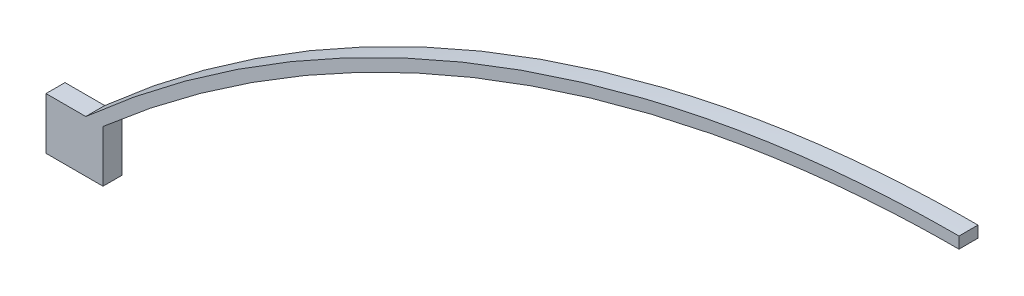
ISO-10303-21;
HEADER;
FILE_DESCRIPTION(('STEP AP214'),'2;1');
FILE_NAME('part.step','',(''),(''),'','','');
FILE_SCHEMA(('AUTOMOTIVE_DESIGN { 1 0 10303 214 1 1 1 1 }'));
ENDSEC;
DATA;
#1=APPLICATION_CONTEXT('core data for automotive mechanical design processes');
#2=APPLICATION_PROTOCOL_DEFINITION('international standard','automotive_design',2000,#1);
#3=PRODUCT_CONTEXT('',#1,'mechanical');
#4=PRODUCT('Part','Part','',(#3));
#5=PRODUCT_RELATED_PRODUCT_CATEGORY('part','',(#4));
#6=PRODUCT_DEFINITION_FORMATION('','',#4);
#7=PRODUCT_DEFINITION_CONTEXT('part definition',#1,'design');
#8=PRODUCT_DEFINITION('design','',#6,#7);
#9=PRODUCT_DEFINITION_SHAPE('','',#8);
#10=(LENGTH_UNIT() NAMED_UNIT(*) SI_UNIT(.MILLI.,.METRE.));
#11=(NAMED_UNIT(*) PLANE_ANGLE_UNIT() SI_UNIT($,.RADIAN.));
#12=(NAMED_UNIT(*) SI_UNIT($,.STERADIAN.) SOLID_ANGLE_UNIT());
#13=UNCERTAINTY_MEASURE_WITH_UNIT(LENGTH_MEASURE(1.E-05),#10,'distance_accuracy_value','');
#14=(GEOMETRIC_REPRESENTATION_CONTEXT(3) GLOBAL_UNCERTAINTY_ASSIGNED_CONTEXT((#13)) GLOBAL_UNIT_ASSIGNED_CONTEXT((#10,
#11,#12)) REPRESENTATION_CONTEXT('',''));
#15=CARTESIAN_POINT('',(0.,0.,0.));
#16=DIRECTION('',(0.,0.,1.));
#17=DIRECTION('',(1.,0.,0.));
#18=AXIS2_PLACEMENT_3D('',#15,#16,#17);
#19=CARTESIAN_POINT('',(0.,0.,0.));
#20=DIRECTION('',(0.,-1.,0.));
#21=DIRECTION('',(1.,0.,0.));
#22=AXIS2_PLACEMENT_3D('',#19,#20,#21);
#23=SPHERICAL_SURFACE('',#22,345.);
#24=CARTESIAN_POINT('',(0.,0.,2.5));
#25=DIRECTION('',(0.,0.,-1.));
#26=DIRECTION('',(-1.,0.,0.));
#27=AXIS2_PLACEMENT_3D('',#24,#25,#26);
#28=CIRCLE('',#27,344.990941910074);
#29=CARTESIAN_POINT('',(0.,344.990941910074,2.5));
#30=VERTEX_POINT('',#29);
#31=CARTESIAN_POINT('',(-229.766015395278,257.344765187437,2.5));
#32=VERTEX_POINT('',#31);
#33=EDGE_CURVE('E107',#30,#32,#28,.F.);
#34=ORIENTED_EDGE('',*,*,#33,.F.);
#35=CARTESIAN_POINT('',(0.,0.,0.));
#36=DIRECTION('',(-1.,0.,0.));
#37=DIRECTION('',(0.,0.,1.));
#38=AXIS2_PLACEMENT_3D('',#35,#36,#37);
#39=CIRCLE('',#38,345.);
#40=CARTESIAN_POINT('',(0.,344.990941910074,-2.5));
#41=VERTEX_POINT('',#40);
#42=EDGE_CURVE('E92',#41,#30,#39,.F.);
#43=ORIENTED_EDGE('',*,*,#42,.F.);
#44=CARTESIAN_POINT('',(0.,0.,-2.5));
#45=DIRECTION('',(0.,0.,-1.));
#46=DIRECTION('',(-1.,0.,0.));
#47=AXIS2_PLACEMENT_3D('',#44,#45,#46);
#48=CIRCLE('',#47,344.990941910074);
#49=CARTESIAN_POINT('',(-229.766015395278,257.344765187437,-2.5));
#50=VERTEX_POINT('',#49);
#51=EDGE_CURVE('E115',#41,#50,#48,.F.);
#52=ORIENTED_EDGE('',*,*,#51,.T.);
#53=CARTESIAN_POINT('',(0.,257.344765187437,0.));
#54=DIRECTION('',(0.,-1.,0.));
#55=DIRECTION('',(0.,0.,-1.));
#56=AXIS2_PLACEMENT_3D('',#53,#54,#55);
#57=CIRCLE('',#56,229.779615785698);
#58=EDGE_CURVE('E11',#32,#50,#57,.T.);
#59=ORIENTED_EDGE('',*,*,#58,.F.);
#60=EDGE_LOOP('',(#34,#43,#52,#59));
#61=FACE_BOUND('',#60,.T.);
#62=ADVANCED_FACE('F33',(#61),#23,.T.);
#63=CARTESIAN_POINT('',(0.,0.,0.));
#64=DIRECTION('',(0.,-1.,0.));
#65=DIRECTION('',(-1.,0.,0.));
#66=AXIS2_PLACEMENT_3D('',#63,#64,#65);
#67=SPHERICAL_SURFACE('',#66,342.);
#68=CARTESIAN_POINT('',(0.,0.,-2.5));
#69=DIRECTION('',(0.,0.,-1.));
#70=DIRECTION('',(-1.,0.,0.));
#71=AXIS2_PLACEMENT_3D('',#68,#69,#70);
#72=CIRCLE('',#71,341.990862451031);
#73=CARTESIAN_POINT('',(-225.236368800918,257.344765187437,-2.5));
#74=VERTEX_POINT('',#73);
#75=CARTESIAN_POINT('',(0.,341.990862451031,-2.5));
#76=VERTEX_POINT('',#75);
#77=EDGE_CURVE('E100',#74,#76,#72,.T.);
#78=ORIENTED_EDGE('',*,*,#77,.T.);
#79=CARTESIAN_POINT('',(0.,0.,0.));
#80=DIRECTION('',(-1.,0.,0.));
#81=DIRECTION('',(0.,0.,1.));
#82=AXIS2_PLACEMENT_3D('',#79,#80,#81);
#83=CIRCLE('',#82,342.);
#84=CARTESIAN_POINT('',(0.,341.990862451031,2.5));
#85=VERTEX_POINT('',#84);
#86=EDGE_CURVE('E47',#85,#76,#83,.T.);
#87=ORIENTED_EDGE('',*,*,#86,.F.);
#88=CARTESIAN_POINT('',(0.,0.,2.5));
#89=DIRECTION('',(0.,0.,-1.));
#90=DIRECTION('',(-1.,0.,0.));
#91=AXIS2_PLACEMENT_3D('',#88,#89,#90);
#92=CIRCLE('',#91,341.990862451031);
#93=CARTESIAN_POINT('',(-225.236368800918,257.344765187437,2.5));
#94=VERTEX_POINT('',#93);
#95=EDGE_CURVE('E54',#94,#85,#92,.T.);
#96=ORIENTED_EDGE('',*,*,#95,.F.);
#97=CARTESIAN_POINT('',(0.,257.344765187437,0.));
#98=DIRECTION('',(0.,-1.,0.));
#99=DIRECTION('',(0.,0.,-1.));
#100=AXIS2_PLACEMENT_3D('',#97,#98,#99);
#101=CIRCLE('',#100,225.250242687157);
#102=EDGE_CURVE('E40',#94,#74,#101,.T.);
#103=ORIENTED_EDGE('',*,*,#102,.T.);
#104=EDGE_LOOP('',(#78,#87,#96,#103));
#105=FACE_BOUND('',#104,.T.);
#106=ADVANCED_FACE('F98',(#105),#67,.F.);
#107=CARTESIAN_POINT('',(0.,345.001,2.5));
#108=DIRECTION('',(0.,0.,-1.));
#109=DIRECTION('',(-1.,0.,0.));
#110=AXIS2_PLACEMENT_3D('',#107,#108,#109);
#111=PLANE('',#110);
#112=ORIENTED_EDGE('',*,*,#95,.T.);
#113=DIRECTION('',(0.,-1.,0.));
#114=VECTOR('',#113,1.);
#115=CARTESIAN_POINT('',(0.,426.361704712598,2.5));
#116=LINE('',#115,#114);
#117=EDGE_CURVE('E89',#30,#85,#116,.T.);
#118=ORIENTED_EDGE('',*,*,#117,.F.);
#119=ORIENTED_EDGE('',*,*,#33,.T.);
#120=DIRECTION('',(-1.,0.,0.));
#121=VECTOR('',#120,1.);
#122=CARTESIAN_POINT('',(-225.236368800918,257.344765187437,2.5));
#123=LINE('',#122,#121);
#124=CARTESIAN_POINT('',(-240.236368800918,257.344765187437,2.5));
#125=VERTEX_POINT('',#124);
#126=EDGE_CURVE('E140',#32,#125,#123,.T.);
#127=ORIENTED_EDGE('',*,*,#126,.T.);
#128=DIRECTION('',(0.,-1.,0.));
#129=VECTOR('',#128,1.);
#130=CARTESIAN_POINT('',(-240.236368800918,257.344765187437,2.5));
#131=LINE('',#130,#129);
#132=CARTESIAN_POINT('',(-240.236368800918,243.717929588826,2.5));
#133=VERTEX_POINT('',#132);
#134=EDGE_CURVE('E142',#125,#133,#131,.T.);
#135=ORIENTED_EDGE('',*,*,#134,.T.);
#136=DIRECTION('',(1.,0.,0.));
#137=VECTOR('',#136,1.);
#138=CARTESIAN_POINT('',(-225.236368800918,243.717929588826,2.5));
#139=LINE('',#138,#137);
#140=CARTESIAN_POINT('',(-225.236368800918,243.717929588826,2.5));
#141=VERTEX_POINT('',#140);
#142=EDGE_CURVE('E138',#133,#141,#139,.T.);
#143=ORIENTED_EDGE('',*,*,#142,.T.);
#144=DIRECTION('',(0.,1.,0.));
#145=VECTOR('',#144,1.);
#146=CARTESIAN_POINT('',(-225.236368800918,257.344765187437,2.5));
#147=LINE('',#146,#145);
#148=EDGE_CURVE('E106',#141,#94,#147,.T.);
#149=ORIENTED_EDGE('',*,*,#148,.T.);
#150=EDGE_LOOP('',(#112,#118,#119,#127,#135,#143,#149));
#151=FACE_BOUND('',#150,.T.);
#152=ADVANCED_FACE('F103',(#151),#111,.F.);
#153=CARTESIAN_POINT('',(0.,345.001,-2.5));
#154=DIRECTION('',(0.,0.,-1.));
#155=DIRECTION('',(-1.,0.,0.));
#156=AXIS2_PLACEMENT_3D('',#153,#154,#155);
#157=PLANE('',#156);
#158=DIRECTION('',(0.,-1.,0.));
#159=VECTOR('',#158,1.);
#160=CARTESIAN_POINT('',(0.,426.361704712598,-2.5));
#161=LINE('',#160,#159);
#162=EDGE_CURVE('E95',#41,#76,#161,.T.);
#163=ORIENTED_EDGE('',*,*,#162,.T.);
#164=ORIENTED_EDGE('',*,*,#77,.F.);
#165=DIRECTION('',(0.,1.,0.));
#166=VECTOR('',#165,1.);
#167=CARTESIAN_POINT('',(-225.236368800918,257.344765187437,-2.5));
#168=LINE('',#167,#166);
#169=CARTESIAN_POINT('',(-225.236368800918,243.717929588826,-2.5));
#170=VERTEX_POINT('',#169);
#171=EDGE_CURVE('E112',#170,#74,#168,.T.);
#172=ORIENTED_EDGE('',*,*,#171,.F.);
#173=DIRECTION('',(1.,0.,0.));
#174=VECTOR('',#173,1.);
#175=CARTESIAN_POINT('',(-225.236368800918,243.717929588826,-2.5));
#176=LINE('',#175,#174);
#177=CARTESIAN_POINT('',(-240.236368800918,243.717929588826,-2.5));
#178=VERTEX_POINT('',#177);
#179=EDGE_CURVE('E128',#178,#170,#176,.T.);
#180=ORIENTED_EDGE('',*,*,#179,.F.);
#181=DIRECTION('',(0.,-1.,0.));
#182=VECTOR('',#181,1.);
#183=CARTESIAN_POINT('',(-240.236368800918,257.344765187437,-2.5));
#184=LINE('',#183,#182);
#185=CARTESIAN_POINT('',(-240.236368800918,257.344765187437,-2.5));
#186=VERTEX_POINT('',#185);
#187=EDGE_CURVE('E124',#186,#178,#184,.T.);
#188=ORIENTED_EDGE('',*,*,#187,.F.);
#189=DIRECTION('',(-1.,0.,0.));
#190=VECTOR('',#189,1.);
#191=CARTESIAN_POINT('',(-225.236368800918,257.344765187437,-2.5));
#192=LINE('',#191,#190);
#193=EDGE_CURVE('E125',#50,#186,#192,.T.);
#194=ORIENTED_EDGE('',*,*,#193,.F.);
#195=ORIENTED_EDGE('',*,*,#51,.F.);
#196=EDGE_LOOP('',(#163,#164,#172,#180,#188,#194,#195));
#197=FACE_BOUND('',#196,.T.);
#198=ADVANCED_FACE('F148',(#197),#157,.T.);
#199=CARTESIAN_POINT('',(-225.236368800918,257.344765187437,-22.7655039027301));
#200=DIRECTION('',(0.,1.,0.));
#201=DIRECTION('',(0.,0.,1.));
#202=AXIS2_PLACEMENT_3D('',#199,#200,#201);
#203=PLANE('',#202);
#204=ORIENTED_EDGE('',*,*,#58,.T.);
#205=ORIENTED_EDGE('',*,*,#193,.T.);
#206=DIRECTION('',(0.,0.,1.));
#207=VECTOR('',#206,1.);
#208=CARTESIAN_POINT('',(-240.236368800918,257.344765187437,-22.7655039027301));
#209=LINE('',#208,#207);
#210=EDGE_CURVE('E121',#186,#125,#209,.T.);
#211=ORIENTED_EDGE('',*,*,#210,.T.);
#212=ORIENTED_EDGE('',*,*,#126,.F.);
#213=EDGE_LOOP('',(#204,#205,#211,#212));
#214=FACE_BOUND('',#213,.T.);
#215=ADVANCED_FACE('F155',(#214),#203,.T.);
#216=ORIENTED_EDGE('',*,*,#102,.F.);
#217=DIRECTION('',(0.,0.,1.));
#218=VECTOR('',#217,1.);
#219=CARTESIAN_POINT('',(-225.236368800918,257.344765187437,-22.7655039027301));
#220=LINE('',#219,#218);
#221=EDGE_CURVE('E108',#74,#94,#220,.T.);
#222=ORIENTED_EDGE('',*,*,#221,.F.);
#223=EDGE_LOOP('',(#216,#222));
#224=FACE_BOUND('',#223,.T.);
#225=ADVANCED_FACE('F167',(#224),#203,.T.);
#226=CARTESIAN_POINT('',(-240.236368800918,257.344765187437,-22.7655039027301));
#227=DIRECTION('',(-1.,0.,0.));
#228=DIRECTION('',(0.,0.,1.));
#229=AXIS2_PLACEMENT_3D('',#226,#227,#228);
#230=PLANE('',#229);
#231=ORIENTED_EDGE('',*,*,#210,.F.);
#232=ORIENTED_EDGE('',*,*,#187,.T.);
#233=DIRECTION('',(0.,0.,1.));
#234=VECTOR('',#233,1.);
#235=CARTESIAN_POINT('',(-240.236368800918,243.717929588826,-22.7655039027301));
#236=LINE('',#235,#234);
#237=EDGE_CURVE('E126',#178,#133,#236,.T.);
#238=ORIENTED_EDGE('',*,*,#237,.T.);
#239=ORIENTED_EDGE('',*,*,#134,.F.);
#240=EDGE_LOOP('',(#231,#232,#238,#239));
#241=FACE_BOUND('',#240,.T.);
#242=ADVANCED_FACE('F158',(#241),#230,.T.);
#243=CARTESIAN_POINT('',(-225.236368800918,243.717929588826,-22.7655039027301));
#244=DIRECTION('',(0.,-1.,0.));
#245=DIRECTION('',(1.,0.,0.));
#246=AXIS2_PLACEMENT_3D('',#243,#244,#245);
#247=PLANE('',#246);
#248=ORIENTED_EDGE('',*,*,#237,.F.);
#249=ORIENTED_EDGE('',*,*,#179,.T.);
#250=DIRECTION('',(0.,0.,1.));
#251=VECTOR('',#250,1.);
#252=CARTESIAN_POINT('',(-225.236368800918,243.717929588826,-22.7655039027301));
#253=LINE('',#252,#251);
#254=EDGE_CURVE('E129',#170,#141,#253,.T.);
#255=ORIENTED_EDGE('',*,*,#254,.T.);
#256=ORIENTED_EDGE('',*,*,#142,.F.);
#257=EDGE_LOOP('',(#248,#249,#255,#256));
#258=FACE_BOUND('',#257,.T.);
#259=ADVANCED_FACE('F161',(#258),#247,.T.);
#260=CARTESIAN_POINT('',(-225.236368800918,257.344765187437,-22.7655039027301));
#261=DIRECTION('',(1.,0.,0.));
#262=DIRECTION('',(0.,0.,-1.));
#263=AXIS2_PLACEMENT_3D('',#260,#261,#262);
#264=PLANE('',#263);
#265=ORIENTED_EDGE('',*,*,#254,.F.);
#266=ORIENTED_EDGE('',*,*,#171,.T.);
#267=ORIENTED_EDGE('',*,*,#221,.T.);
#268=ORIENTED_EDGE('',*,*,#148,.F.);
#269=EDGE_LOOP('',(#265,#266,#267,#268));
#270=FACE_BOUND('',#269,.T.);
#271=ADVANCED_FACE('F164',(#270),#264,.T.);
#272=CARTESIAN_POINT('',(0.,426.361704712598,-2.501));
#273=DIRECTION('',(-1.,0.,0.));
#274=DIRECTION('',(0.,0.,1.));
#275=AXIS2_PLACEMENT_3D('',#272,#273,#274);
#276=PLANE('',#275);
#277=ORIENTED_EDGE('',*,*,#42,.T.);
#278=ORIENTED_EDGE('',*,*,#117,.T.);
#279=ORIENTED_EDGE('',*,*,#86,.T.);
#280=ORIENTED_EDGE('',*,*,#162,.F.);
#281=EDGE_LOOP('',(#277,#278,#279,#280));
#282=FACE_BOUND('',#281,.T.);
#283=ADVANCED_FACE('F90',(#282),#276,.F.);
#284=CLOSED_SHELL('',(#62,#106,#152,#198,#215,#225,#242,#259,#271,#283));
#285=MANIFOLD_SOLID_BREP('B2',#284);
#286=ADVANCED_BREP_SHAPE_REPRESENTATION('',(#18,#285),#14);
#287=SHAPE_DEFINITION_REPRESENTATION(#9,#286);
ENDSEC;
END-ISO-10303-21;
